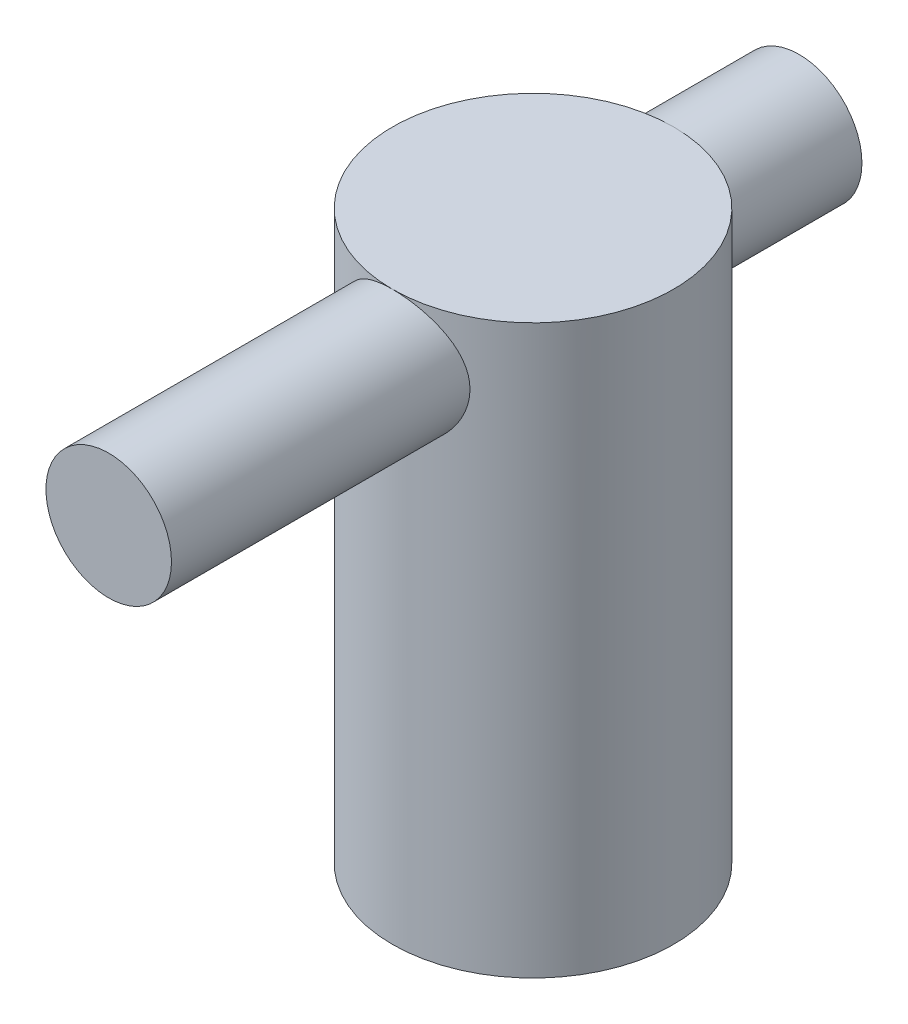
ISO-10303-21;
HEADER;
FILE_DESCRIPTION(('STEP AP214'),'2;1');
FILE_NAME('part.step','',(''),(''),'','','');
FILE_SCHEMA(('AUTOMOTIVE_DESIGN { 1 0 10303 214 1 1 1 1 }'));
ENDSEC;
DATA;
#1=APPLICATION_CONTEXT('core data for automotive mechanical design processes');
#2=APPLICATION_PROTOCOL_DEFINITION('international standard','automotive_design',2000,#1);
#3=PRODUCT_CONTEXT('',#1,'mechanical');
#4=PRODUCT('Part','Part','',(#3));
#5=PRODUCT_RELATED_PRODUCT_CATEGORY('part','',(#4));
#6=PRODUCT_DEFINITION_FORMATION('','',#4);
#7=PRODUCT_DEFINITION_CONTEXT('part definition',#1,'design');
#8=PRODUCT_DEFINITION('design','',#6,#7);
#9=PRODUCT_DEFINITION_SHAPE('','',#8);
#10=(LENGTH_UNIT() NAMED_UNIT(*) SI_UNIT(.MILLI.,.METRE.));
#11=(NAMED_UNIT(*) PLANE_ANGLE_UNIT() SI_UNIT($,.RADIAN.));
#12=(NAMED_UNIT(*) SI_UNIT($,.STERADIAN.) SOLID_ANGLE_UNIT());
#13=UNCERTAINTY_MEASURE_WITH_UNIT(LENGTH_MEASURE(1.E-05),#10,'distance_accuracy_value','');
#14=(GEOMETRIC_REPRESENTATION_CONTEXT(3) GLOBAL_UNCERTAINTY_ASSIGNED_CONTEXT((#13)) GLOBAL_UNIT_ASSIGNED_CONTEXT((#10,
#11,#12)) REPRESENTATION_CONTEXT('',''));
#15=CARTESIAN_POINT('',(0.,0.,0.));
#16=DIRECTION('',(0.,0.,1.));
#17=DIRECTION('',(1.,0.,0.));
#18=AXIS2_PLACEMENT_3D('',#15,#16,#17);
#19=CARTESIAN_POINT('',(0.,57.404,0.));
#20=DIRECTION('',(0.,-1.,0.));
#21=DIRECTION('',(0.,0.,-1.));
#22=AXIS2_PLACEMENT_3D('',#19,#20,#21);
#23=CYLINDRICAL_SURFACE('',#22,14.224);
#24=CARTESIAN_POINT('',(0.,57.404,0.));
#25=DIRECTION('',(0.,1.,0.));
#26=DIRECTION('',(0.,0.,1.));
#27=AXIS2_PLACEMENT_3D('',#24,#25,#26);
#28=CIRCLE('',#27,14.224);
#29=CARTESIAN_POINT('',(0.,57.404,-14.224));
#30=VERTEX_POINT('',#29);
#31=CARTESIAN_POINT('',(0.,57.404,14.224));
#32=VERTEX_POINT('',#31);
#33=EDGE_CURVE('E55',#30,#32,#28,.T.);
#34=ORIENTED_EDGE('',*,*,#33,.F.);
#35=CARTESIAN_POINT('',(0.,57.404,-14.224));
#36=CARTESIAN_POINT('',(-0.169064131729769,57.4039987415316,-14.2239989454364));
#37=CARTESIAN_POINT('',(-0.338170293414769,57.3972394062399,-14.2209778895958));
#38=CARTESIAN_POINT('',(-0.675164422776245,57.3702689876632,-14.2089685890767));
#39=CARTESIAN_POINT('',(-0.843051645611251,57.3500502817015,-14.1999769629898));
#40=CARTESIAN_POINT('',(-1.17659843144288,57.2963313387486,-14.1762405036873));
#41=CARTESIAN_POINT('',(-1.3422532667633,57.2628064522875,-14.1614849937835));
#42=CARTESIAN_POINT('',(-1.66989459320146,57.1828175198381,-14.1265985270013));
#43=CARTESIAN_POINT('',(-1.83187955533246,57.1363481842083,-14.1064653727319));
#44=CARTESIAN_POINT('',(-2.1503925253457,57.0311505420019,-14.0614279364772));
#45=CARTESIAN_POINT('',(-2.30693987451225,56.9724723345735,-14.0365431859962));
#46=CARTESIAN_POINT('',(-2.61436305128336,56.8432506515707,-13.9825481897339));
#47=CARTESIAN_POINT('',(-2.76523672788118,56.7727027303378,-13.9534363613131));
#48=CARTESIAN_POINT('',(-3.06032218322675,56.6203698611024,-13.8916990738707));
#49=CARTESIAN_POINT('',(-3.20453829419942,56.5385923621843,-13.8590759471269));
#50=CARTESIAN_POINT('',(-3.48569666746665,56.364348868719,-13.7910499149219));
#51=CARTESIAN_POINT('',(-3.62263625501127,56.2718789829275,-13.7556459989702));
#52=CARTESIAN_POINT('',(-4.03500412909824,55.9694022284064,-13.6427491781487));
#53=CARTESIAN_POINT('',(-4.29702558535442,55.7420183063951,-13.5618075704459));
#54=CARTESIAN_POINT('',(-4.78065056902209,55.2477492948067,-13.3989880389265));
#55=CARTESIAN_POINT('',(-5.00222978854211,54.9808406222078,-13.3171095832257));
#56=CARTESIAN_POINT('',(-5.30621568033235,54.5468901638267,-13.1976917762748));
#57=CARTESIAN_POINT('',(-5.40507304101554,54.3919006889985,-13.1574063970087));
#58=CARTESIAN_POINT('',(-5.58927624131654,54.0733222806299,-13.0802190265538));
#59=CARTESIAN_POINT('',(-5.67462772885047,53.9097369800369,-13.0433156238141));
#60=CARTESIAN_POINT('',(-5.83107812880833,53.5749471949456,-12.9741292300982));
#61=CARTESIAN_POINT('',(-5.90217701861777,53.4037426983585,-12.941846246453));
#62=CARTESIAN_POINT('',(-6.02935119148151,53.0549623701482,-12.8830901247516));
#63=CARTESIAN_POINT('',(-6.08543458216381,52.8773900358176,-12.8566138527603));
#64=CARTESIAN_POINT('',(-6.17941066513843,52.5266176151303,-12.8116989603364));
#65=CARTESIAN_POINT('',(-6.21810297278447,52.3536764732965,-12.7929116873767));
#66=CARTESIAN_POINT('',(-6.28093882906494,52.0046466254234,-12.7621789609949));
#67=CARTESIAN_POINT('',(-6.30508940813674,51.8285594828383,-12.7502302015199));
#68=CARTESIAN_POINT('',(-6.33853971923257,51.4746988545944,-12.7336342324333));
#69=CARTESIAN_POINT('',(-6.347844744329,51.296925992718,-12.7289844204456));
#70=CARTESIAN_POINT('',(-6.35148865273605,50.9411942243157,-12.7271668063681));
#71=CARTESIAN_POINT('',(-6.34582851131983,50.763235330669,-12.7299985167108));
#72=CARTESIAN_POINT('',(-6.32081807462496,50.4248065446407,-12.7424330938839));
#73=CARTESIAN_POINT('',(-6.3027574110348,50.2642157571043,-12.7513978428272));
#74=CARTESIAN_POINT('',(-6.25453306144935,49.9452437530645,-12.7751209170416));
#75=CARTESIAN_POINT('',(-6.22436546854594,49.7868632669143,-12.7898811124708));
#76=CARTESIAN_POINT('',(-6.15225191906018,49.4734460825589,-12.8247249950343));
#77=CARTESIAN_POINT('',(-6.11030831443204,49.3184087233017,-12.844807619106));
#78=CARTESIAN_POINT('',(-6.01502717545124,49.0125237281115,-12.8897011825212));
#79=CARTESIAN_POINT('',(-5.96168522056778,48.8616777434075,-12.9145139559167));
#80=CARTESIAN_POINT('',(-5.84276161844015,48.5617681937587,-12.968757486444));
#81=CARTESIAN_POINT('',(-5.77693555937323,48.4128176670755,-12.9982781705812));
#82=CARTESIAN_POINT('',(-5.63437970471472,48.1209663367698,-13.0607046943084));
#83=CARTESIAN_POINT('',(-5.5576462460126,47.9780675865703,-13.0936116701121));
#84=CARTESIAN_POINT('',(-5.31177387979408,47.5594151848417,-13.1961624273931));
#85=CARTESIAN_POINT('',(-5.12690085590811,47.2935497214102,-13.2696656267034));
#86=CARTESIAN_POINT('',(-4.81162285348535,46.9064403413664,-13.3859891191241));
#87=CARTESIAN_POINT('',(-4.69417522661855,46.7739808688531,-13.4277224376545));
#88=CARTESIAN_POINT('',(-4.44861453742545,46.5192930799527,-13.51106185828));
#89=CARTESIAN_POINT('',(-4.32050443238619,46.3970619454262,-13.5526679923533));
#90=CARTESIAN_POINT('',(-4.0542217604112,46.1634796896047,-13.6346942414802));
#91=CARTESIAN_POINT('',(-3.91604244673153,46.0521359824765,-13.6751135353872));
#92=CARTESIAN_POINT('',(-3.63048073575631,45.8411693149707,-13.7536795817658));
#93=CARTESIAN_POINT('',(-3.48310204162086,45.7415416843368,-13.791827236743));
#94=CARTESIAN_POINT('',(-3.17526288425157,45.5518290532424,-13.8659908790356));
#95=CARTESIAN_POINT('',(-3.0145401099018,45.4621293773051,-13.9019059080407));
#96=CARTESIAN_POINT('',(-2.68521731677173,45.2967400266662,-13.9692524691579));
#97=CARTESIAN_POINT('',(-2.51662057970846,45.221044579393,-14.0006858473847));
#98=CARTESIAN_POINT('',(-2.17271141392278,45.0844063116851,-14.0581606990394));
#99=CARTESIAN_POINT('',(-1.99740095412563,45.0234592038214,-14.084203739151));
#100=CARTESIAN_POINT('',(-1.64137231314383,44.916988490521,-14.1301194515932));
#101=CARTESIAN_POINT('',(-1.46065461419103,44.8714635141335,-14.1499926723768));
#102=CARTESIAN_POINT('',(-1.10819523205099,44.7990454890028,-14.1817894834687));
#103=CARTESIAN_POINT('',(-0.936717799404804,44.7710660135281,-14.1941743880478));
#104=CARTESIAN_POINT('',(-0.591718289173316,44.729242559258,-14.2127365162427));
#105=CARTESIAN_POINT('',(-0.418196346100836,44.7153976557132,-14.2189141459667));
#106=CARTESIAN_POINT('',(-0.0705420384489613,44.7020099706676,-14.2248872665466));
#107=CARTESIAN_POINT('',(0.103590138006332,44.7024631129845,-14.2246845763468));
#108=CARTESIAN_POINT('',(0.451102210308927,44.7176561972051,-14.2179070847327));
#109=CARTESIAN_POINT('',(0.624482127604827,44.732395729047,-14.2113324662118));
#110=CARTESIAN_POINT('',(0.958925872296469,44.7746946422579,-14.1925691248646));
#111=CARTESIAN_POINT('',(1.12011268888394,44.8014461214442,-14.1807346182033));
#112=CARTESIAN_POINT('',(1.43955285914873,44.8671763907251,-14.1518758560333));
#113=CARTESIAN_POINT('',(1.59780524879768,44.9061591262578,-14.1348499259763));
#114=CARTESIAN_POINT('',(1.91025786414708,44.9959614216401,-14.096023195584));
#115=CARTESIAN_POINT('',(2.06445925291635,45.046777541788,-14.0742237829035));
#116=CARTESIAN_POINT('',(2.36799407551973,45.1598209651761,-14.0263467006255));
#117=CARTESIAN_POINT('',(2.51732562549471,45.2220526241755,-14.0002673983777));
#118=CARTESIAN_POINT('',(2.81475768702214,45.3595033524635,-13.9435621901501));
#119=CARTESIAN_POINT('',(2.96267895853888,45.4350631018436,-13.9128210839485));
#120=CARTESIAN_POINT('',(3.25165385011778,45.5971945861696,-13.8481366043457));
#121=CARTESIAN_POINT('',(3.39270491851985,45.6837703700971,-13.8141920546987));
#122=CARTESIAN_POINT('',(3.80444154846649,45.9591333152942,-13.7087013216744));
#123=CARTESIAN_POINT('',(4.06387255196499,46.1636314296955,-13.633465876444));
#124=CARTESIAN_POINT('',(4.56717971985251,46.627950297176,-13.4736195924533));
#125=CARTESIAN_POINT('',(4.80807968829956,46.8909158985695,-13.388743660402));
#126=CARTESIAN_POINT('',(5.13436921385734,47.313341946557,-13.2655200786573));
#127=CARTESIAN_POINT('',(5.23735015928865,47.4589279071326,-13.2250997857719));
#128=CARTESIAN_POINT('',(5.43096216440055,47.7587083729981,-13.1467756913302));
#129=CARTESIAN_POINT('',(5.52159808495032,47.9128994560996,-13.1088709023231));
#130=CARTESIAN_POINT('',(5.6919259511535,48.2329785409307,-13.0358338851607));
#131=CARTESIAN_POINT('',(5.77129071415856,48.3990617997318,-13.0007937377191));
#132=CARTESIAN_POINT('',(5.91556212889423,48.7382772141741,-12.9357861183189));
#133=CARTESIAN_POINT('',(5.9804751848489,48.9114062071299,-12.905816400836));
#134=CARTESIAN_POINT('',(6.09513432155158,49.2634455547587,-12.8520631516823));
#135=CARTESIAN_POINT('',(6.14488936920736,49.4423524219022,-12.8282759638874));
#136=CARTESIAN_POINT('',(6.22864768874855,49.8046021960672,-12.787818287225));
#137=CARTESIAN_POINT('',(6.26265276275062,49.9879445930469,-12.771146984173));
#138=CARTESIAN_POINT('',(6.31222710443848,50.3416717529188,-12.7467116124661));
#139=CARTESIAN_POINT('',(6.32912158768412,50.5118276915818,-12.7383090273014));
#140=CARTESIAN_POINT('',(6.34912391978851,50.8531441440756,-12.7283514305887));
#141=CARTESIAN_POINT('',(6.35223267108621,51.0243045914151,-12.7267959708155));
#142=CARTESIAN_POINT('',(6.34462473222798,51.3662057270815,-12.7305903066576));
#143=CARTESIAN_POINT('',(6.33391064813108,51.5369464884533,-12.7359388006507));
#144=CARTESIAN_POINT('',(6.29879998872588,51.8766652323429,-12.7533398469021));
#145=CARTESIAN_POINT('',(6.27440363643877,52.0456432435478,-12.765392289886));
#146=CARTESIAN_POINT('',(6.21414570374576,52.3702225472795,-12.7948276807417));
#147=CARTESIAN_POINT('',(6.17908212900159,52.5260070726241,-12.811836924727));
#148=CARTESIAN_POINT('',(6.09751083985731,52.8339561930594,-12.8508591355222));
#149=CARTESIAN_POINT('',(6.05099947412219,52.9861196161645,-12.8728736986345));
#150=CARTESIAN_POINT('',(5.94695821933483,53.2858942152981,-12.9212674037334));
#151=CARTESIAN_POINT('',(5.88942977445863,53.4335059850398,-12.9476459736017));
#152=CARTESIAN_POINT('',(5.76380680383267,53.7234619560933,-13.0040549581279));
#153=CARTESIAN_POINT('',(5.69570841117874,53.8658042059089,-13.0340867083902));
#154=CARTESIAN_POINT('',(5.46689995021055,54.3016956449513,-13.1325516547723));
#155=CARTESIAN_POINT('',(5.28828946531234,54.5849199990436,-13.2061290912658));
#156=CARTESIAN_POINT('',(4.88973585599202,55.1189868354345,-13.3588197028986));
#157=CARTESIAN_POINT('',(4.66977527247781,55.3698155637068,-13.4379352074663));
#158=CARTESIAN_POINT('',(4.30178572595674,55.7283991352134,-13.558596272528));
#159=CARTESIAN_POINT('',(4.16658201765511,55.8493136157509,-13.6008527591879));
#160=CARTESIAN_POINT('',(3.88602995057586,56.0793503387565,-13.6836509839816));
#161=CARTESIAN_POINT('',(3.7406851569712,56.1884766913893,-13.7241933167689));
#162=CARTESIAN_POINT('',(3.44051666705064,56.394271057481,-13.8025036243447));
#163=CARTESIAN_POINT('',(3.28568426105107,56.4909273627828,-13.8402689777215));
#164=CARTESIAN_POINT('',(2.96765193535108,56.6708406114404,-13.9119289609799));
#165=CARTESIAN_POINT('',(2.80445593202991,56.7541037521006,-13.9458253789799));
#166=CARTESIAN_POINT('',(2.47241626069171,56.9057196297752,-14.0084824637683));
#167=CARTESIAN_POINT('',(2.30364811527158,56.9742171664823,-14.0372924515292));
#168=CARTESIAN_POINT('',(1.96015685953324,57.0966406505657,-14.0893616536695));
#169=CARTESIAN_POINT('',(1.78543666428462,57.1505736187355,-14.1126235418546));
#170=CARTESIAN_POINT('',(1.43174620718754,57.2431796972977,-14.1528755433288));
#171=CARTESIAN_POINT('',(1.2527871715224,57.2818891785686,-14.169880598655));
#172=CARTESIAN_POINT('',(0.891782266010684,57.3437312810012,-14.1971694062276));
#173=CARTESIAN_POINT('',(0.70973862152527,57.3668746794547,-14.2074578086529));
#174=CARTESIAN_POINT('',(0.439369739434102,57.3893919419729,-14.2174833835323));
#175=CARTESIAN_POINT('',(0.35160841261814,57.3948677475147,-14.2199250923983));
#176=CARTESIAN_POINT('',(0.175901850736047,57.4021721264098,-14.2231836849856));
#177=CARTESIAN_POINT('',(0.0879566134123702,57.4040006547256,-14.2240005486429));
#178=CARTESIAN_POINT('',(0.,57.404,-14.224));
#179=B_SPLINE_CURVE_WITH_KNOTS('',3,(#35,#36,#37,#38,#39,#40,#41,#42,#43,#44,#45,#46,#47,#48,
#49,#50,#51,#52,#53,#54,#55,#56,#57,#58,#59,#60,#61,#62,#63,#64,#65,#66,#67,#68,#69,#70,#71,#72,
#73,#74,#75,#76,#77,#78,#79,#80,#81,#82,#83,#84,#85,#86,#87,#88,#89,#90,#91,#92,#93,#94,#95,#96,
#97,#98,#99,#100,#101,#102,#103,#104,#105,#106,#107,#108,#109,#110,#111,#112,#113,#114,#115,
#116,#117,#118,#119,#120,#121,#122,#123,#124,#125,#126,#127,#128,#129,#130,#131,#132,#133,#134,
#135,#136,#137,#138,#139,#140,#141,#142,#143,#144,#145,#146,#147,#148,#149,#150,#151,#152,#153,
#154,#155,#156,#157,#158,#159,#160,#161,#162,#163,#164,#165,#166,#167,#168,#169,#170,#171,#172,
#173,#174,#175,#176,#177,#178),.UNSPECIFIED.,.T.,.F.,(4,2,2,2,2,2,2,2,2,2,2,2,2,2,2,2,2,2,2,2,2,
2,2,2,2,2,2,2,2,2,2,2,2,2,2,2,2,2,2,2,2,2,2,2,2,2,2,2,2,2,2,2,2,2,2,2,2,2,2,2,2,2,2,2,2,2,2,2,2,
2,2,4),(0.,0.507104156892433,1.01449575541371,1.52283170822346,2.03137569379082,
2.53787263049204,3.0445596935521,3.55091225746562,4.05744967999993,5.12132603718107,
6.18583974872282,6.74982329801768,7.31357037255168,7.87731834157231,8.44076129782051,
8.97466088263864,9.50830213725078,10.0417530834684,10.5751692657851,11.0601548869978,
11.5452971391577,12.0303425655267,12.5155764456948,13.0115323922066,13.507655294428,
14.4993956775397,15.0445766767953,15.5896069683079,16.1350058691069,16.6801866210055,
17.2420510441736,17.8036833471365,18.3651521836098,18.9265710951912,19.4484492051604,
19.9702931692531,20.4919883639323,21.0136685848518,21.5045616913013,21.9956133082879,
22.486522365277,22.9776191266252,23.4838257539312,23.9902189796158,25.00246679058,
26.0969547422251,26.6449844220719,27.1927976868399,27.7541976911302,28.3153484155453,
28.8761665368122,29.4369204732407,29.9498392024438,30.4627243545639,30.9755128250958,
31.4882929374106,31.9695150606022,32.450890871556,32.932203624404,33.4136928772956,
34.4376559457124,35.4620523331176,36.0202141683233,36.5781807568456,37.1366674669594,
37.6948950052437,38.2473704340328,38.7995790668764,39.3504602685509,39.9009596698776,
40.1647803459189,40.4286042796608),.UNSPECIFIED.);
#180=EDGE_CURVE('E60',#30,#30,#179,.T.);
#181=ORIENTED_EDGE('',*,*,#180,.T.);
#182=EDGE_CURVE('E11',#32,#30,#28,.T.);
#183=ORIENTED_EDGE('',*,*,#182,.F.);
#184=CARTESIAN_POINT('',(0.,57.404,14.224));
#185=CARTESIAN_POINT('',(0.169064131729771,57.4039987415316,14.2239989454364));
#186=CARTESIAN_POINT('',(0.33817029341477,57.3972394062399,14.2209778895958));
#187=CARTESIAN_POINT('',(0.675164422776247,57.3702689876632,14.2089685890767));
#188=CARTESIAN_POINT('',(0.843051645611252,57.3500502817015,14.1999769629898));
#189=CARTESIAN_POINT('',(1.17659843144288,57.2963313387486,14.1762405036873));
#190=CARTESIAN_POINT('',(1.3422532667633,57.2628064522876,14.1614849937835));
#191=CARTESIAN_POINT('',(1.66989459320146,57.1828175198381,14.1265985270013));
#192=CARTESIAN_POINT('',(1.83187955533246,57.1363481842083,14.1064653727319));
#193=CARTESIAN_POINT('',(2.1503925253457,57.0311505420019,14.0614279364772));
#194=CARTESIAN_POINT('',(2.30693987451226,56.9724723345735,14.0365431859962));
#195=CARTESIAN_POINT('',(2.61436305128336,56.8432506515707,13.9825481897339));
#196=CARTESIAN_POINT('',(2.76523672788118,56.7727027303378,13.9534363613131));
#197=CARTESIAN_POINT('',(3.06032218322676,56.6203698611024,13.8916990738707));
#198=CARTESIAN_POINT('',(3.20453829419943,56.5385923621843,13.8590759471269));
#199=CARTESIAN_POINT('',(3.48569666746665,56.364348868719,13.7910499149219));
#200=CARTESIAN_POINT('',(3.62263625501127,56.2718789829275,13.7556459989702));
#201=CARTESIAN_POINT('',(4.03500412909824,55.9694022284064,13.6427491781487));
#202=CARTESIAN_POINT('',(4.29702558535442,55.7420183063951,13.5618075704458));
#203=CARTESIAN_POINT('',(4.78065056902209,55.2477492948067,13.3989880389265));
#204=CARTESIAN_POINT('',(5.00222978854212,54.9808406222078,13.3171095832257));
#205=CARTESIAN_POINT('',(5.30621568033236,54.5468901638267,13.1976917762748));
#206=CARTESIAN_POINT('',(5.40507304101554,54.3919006889985,13.1574063970087));
#207=CARTESIAN_POINT('',(5.58927624131655,54.0733222806299,13.0802190265538));
#208=CARTESIAN_POINT('',(5.67462772885047,53.9097369800369,13.0433156238141));
#209=CARTESIAN_POINT('',(5.83107812880833,53.5749471949456,12.9741292300982));
#210=CARTESIAN_POINT('',(5.90217701861777,53.4037426983585,12.941846246453));
#211=CARTESIAN_POINT('',(6.02935119148151,53.0549623701482,12.8830901247516));
#212=CARTESIAN_POINT('',(6.08543458216381,52.8773900358176,12.8566138527603));
#213=CARTESIAN_POINT('',(6.17941066513844,52.5266176151303,12.8116989603364));
#214=CARTESIAN_POINT('',(6.21810297278447,52.3536764732965,12.7929116873767));
#215=CARTESIAN_POINT('',(6.28093882906494,52.0046466254234,12.7621789609949));
#216=CARTESIAN_POINT('',(6.30508940813675,51.8285594828383,12.7502302015199));
#217=CARTESIAN_POINT('',(6.33853971923257,51.4746988545945,12.7336342324333));
#218=CARTESIAN_POINT('',(6.347844744329,51.296925992718,12.7289844204456));
#219=CARTESIAN_POINT('',(6.35148865273606,50.9411942243157,12.7271668063681));
#220=CARTESIAN_POINT('',(6.34582851131984,50.763235330669,12.7299985167108));
#221=CARTESIAN_POINT('',(6.32081807462496,50.4248065446407,12.7424330938839));
#222=CARTESIAN_POINT('',(6.30275741103481,50.2642157571043,12.7513978428272));
#223=CARTESIAN_POINT('',(6.25453306144935,49.9452437530645,12.7751209170416));
#224=CARTESIAN_POINT('',(6.22436546854594,49.7868632669143,12.7898811124708));
#225=CARTESIAN_POINT('',(6.15225191906018,49.4734460825589,12.8247249950343));
#226=CARTESIAN_POINT('',(6.11030831443204,49.3184087233017,12.844807619106));
#227=CARTESIAN_POINT('',(6.01502717545124,49.0125237281115,12.8897011825212));
#228=CARTESIAN_POINT('',(5.96168522056779,48.8616777434075,12.9145139559167));
#229=CARTESIAN_POINT('',(5.84276161844015,48.5617681937587,12.968757486444));
#230=CARTESIAN_POINT('',(5.77693555937323,48.4128176670755,12.9982781705812));
#231=CARTESIAN_POINT('',(5.63437970471472,48.1209663367698,13.0607046943084));
#232=CARTESIAN_POINT('',(5.5576462460126,47.9780675865703,13.0936116701121));
#233=CARTESIAN_POINT('',(5.31177387979408,47.5594151848417,13.1961624273931));
#234=CARTESIAN_POINT('',(5.12690085590811,47.2935497214102,13.2696656267034));
#235=CARTESIAN_POINT('',(4.81162285348535,46.9064403413664,13.3859891191241));
#236=CARTESIAN_POINT('',(4.69417522661855,46.7739808688531,13.4277224376545));
#237=CARTESIAN_POINT('',(4.44861453742545,46.5192930799527,13.51106185828));
#238=CARTESIAN_POINT('',(4.32050443238619,46.3970619454262,13.5526679923533));
#239=CARTESIAN_POINT('',(4.0542217604112,46.1634796896047,13.6346942414802));
#240=CARTESIAN_POINT('',(3.91604244673153,46.0521359824765,13.6751135353872));
#241=CARTESIAN_POINT('',(3.63048073575631,45.8411693149707,13.7536795817658));
#242=CARTESIAN_POINT('',(3.48310204162086,45.7415416843368,13.791827236743));
#243=CARTESIAN_POINT('',(3.17526288425157,45.5518290532424,13.8659908790356));
#244=CARTESIAN_POINT('',(3.0145401099018,45.4621293773051,13.9019059080407));
#245=CARTESIAN_POINT('',(2.68521731677173,45.2967400266662,13.9692524691579));
#246=CARTESIAN_POINT('',(2.51662057970846,45.221044579393,14.0006858473847));
#247=CARTESIAN_POINT('',(2.17271141392278,45.0844063116851,14.0581606990394));
#248=CARTESIAN_POINT('',(1.99740095412563,45.0234592038214,14.084203739151));
#249=CARTESIAN_POINT('',(1.64137231314383,44.916988490521,14.1301194515932));
#250=CARTESIAN_POINT('',(1.46065461419103,44.8714635141335,14.1499926723768));
#251=CARTESIAN_POINT('',(1.108195232051,44.7990454890028,14.1817894834687));
#252=CARTESIAN_POINT('',(0.936717799404807,44.7710660135281,14.1941743880478));
#253=CARTESIAN_POINT('',(0.591718289173321,44.729242559258,14.2127365162427));
#254=CARTESIAN_POINT('',(0.418196346100842,44.7153976557132,14.2189141459667));
#255=CARTESIAN_POINT('',(0.0705420384489678,44.7020099706676,14.2248872665466));
#256=CARTESIAN_POINT('',(-0.103590138006326,44.7024631129845,14.2246845763468));
#257=CARTESIAN_POINT('',(-0.451102210308921,44.7176561972051,14.2179070847327));
#258=CARTESIAN_POINT('',(-0.624482127604822,44.732395729047,14.2113324662118));
#259=CARTESIAN_POINT('',(-0.958925872296463,44.7746946422579,14.1925691248646));
#260=CARTESIAN_POINT('',(-1.12011268888393,44.8014461214442,14.1807346182033));
#261=CARTESIAN_POINT('',(-1.43955285914872,44.8671763907251,14.1518758560333));
#262=CARTESIAN_POINT('',(-1.59780524879768,44.9061591262578,14.1348499259763));
#263=CARTESIAN_POINT('',(-1.91025786414708,44.9959614216401,14.096023195584));
#264=CARTESIAN_POINT('',(-2.06445925291635,45.046777541788,14.0742237829035));
#265=CARTESIAN_POINT('',(-2.36799407551973,45.1598209651761,14.0263467006255));
#266=CARTESIAN_POINT('',(-2.5173256254947,45.2220526241755,14.0002673983777));
#267=CARTESIAN_POINT('',(-2.81475768702214,45.3595033524635,13.9435621901501));
#268=CARTESIAN_POINT('',(-2.96267895853887,45.4350631018436,13.9128210839485));
#269=CARTESIAN_POINT('',(-3.25165385011778,45.5971945861696,13.8481366043457));
#270=CARTESIAN_POINT('',(-3.39270491851984,45.6837703700971,13.8141920546987));
#271=CARTESIAN_POINT('',(-3.80444154846648,45.9591333152942,13.7087013216744));
#272=CARTESIAN_POINT('',(-4.06387255196499,46.1636314296955,13.633465876444));
#273=CARTESIAN_POINT('',(-4.56717971985251,46.627950297176,13.4736195924533));
#274=CARTESIAN_POINT('',(-4.80807968829956,46.8909158985695,13.388743660402));
#275=CARTESIAN_POINT('',(-5.13436921385733,47.313341946557,13.2655200786573));
#276=CARTESIAN_POINT('',(-5.23735015928864,47.4589279071326,13.2250997857719));
#277=CARTESIAN_POINT('',(-5.43096216440054,47.7587083729981,13.1467756913302));
#278=CARTESIAN_POINT('',(-5.52159808495032,47.9128994560996,13.1088709023231));
#279=CARTESIAN_POINT('',(-5.69192595115349,48.2329785409307,13.0358338851607));
#280=CARTESIAN_POINT('',(-5.77129071415855,48.3990617997318,13.0007937377191));
#281=CARTESIAN_POINT('',(-5.91556212889422,48.7382772141741,12.9357861183189));
#282=CARTESIAN_POINT('',(-5.98047518484889,48.9114062071299,12.905816400836));
#283=CARTESIAN_POINT('',(-6.09513432155158,49.2634455547587,12.8520631516823));
#284=CARTESIAN_POINT('',(-6.14488936920736,49.4423524219022,12.8282759638874));
#285=CARTESIAN_POINT('',(-6.22864768874854,49.8046021960672,12.787818287225));
#286=CARTESIAN_POINT('',(-6.26265276275062,49.9879445930468,12.771146984173));
#287=CARTESIAN_POINT('',(-6.31222710443848,50.3416717529188,12.7467116124661));
#288=CARTESIAN_POINT('',(-6.32912158768411,50.5118276915818,12.7383090273014));
#289=CARTESIAN_POINT('',(-6.34912391978851,50.8531441440756,12.7283514305887));
#290=CARTESIAN_POINT('',(-6.35223267108621,51.0243045914151,12.7267959708155));
#291=CARTESIAN_POINT('',(-6.34462473222798,51.3662057270815,12.7305903066576));
#292=CARTESIAN_POINT('',(-6.33391064813108,51.5369464884533,12.7359388006507));
#293=CARTESIAN_POINT('',(-6.29879998872588,51.8766652323429,12.7533398469021));
#294=CARTESIAN_POINT('',(-6.27440363643877,52.0456432435478,12.7653922898861));
#295=CARTESIAN_POINT('',(-6.21414570374575,52.3702225472795,12.7948276807417));
#296=CARTESIAN_POINT('',(-6.17908212900159,52.5260070726241,12.811836924727));
#297=CARTESIAN_POINT('',(-6.0975108398573,52.8339561930594,12.8508591355222));
#298=CARTESIAN_POINT('',(-6.05099947412218,52.9861196161645,12.8728736986345));
#299=CARTESIAN_POINT('',(-5.94695821933483,53.2858942152981,12.9212674037334));
#300=CARTESIAN_POINT('',(-5.88942977445863,53.4335059850398,12.9476459736017));
#301=CARTESIAN_POINT('',(-5.76380680383266,53.7234619560933,13.0040549581279));
#302=CARTESIAN_POINT('',(-5.69570841117874,53.8658042059089,13.0340867083902));
#303=CARTESIAN_POINT('',(-5.46689995021055,54.3016956449513,13.1325516547723));
#304=CARTESIAN_POINT('',(-5.28828946531234,54.5849199990436,13.2061290912658));
#305=CARTESIAN_POINT('',(-4.88973585599202,55.1189868354345,13.3588197028986));
#306=CARTESIAN_POINT('',(-4.66977527247781,55.3698155637068,13.4379352074663));
#307=CARTESIAN_POINT('',(-4.30178572595674,55.7283991352134,13.558596272528));
#308=CARTESIAN_POINT('',(-4.16658201765511,55.8493136157509,13.6008527591879));
#309=CARTESIAN_POINT('',(-3.88602995057585,56.0793503387565,13.6836509839816));
#310=CARTESIAN_POINT('',(-3.74068515697119,56.1884766913893,13.7241933167689));
#311=CARTESIAN_POINT('',(-3.44051666705064,56.394271057481,13.8025036243447));
#312=CARTESIAN_POINT('',(-3.28568426105107,56.4909273627828,13.8402689777215));
#313=CARTESIAN_POINT('',(-2.96765193535108,56.6708406114404,13.9119289609799));
#314=CARTESIAN_POINT('',(-2.80445593202991,56.7541037521006,13.9458253789799));
#315=CARTESIAN_POINT('',(-2.47241626069171,56.9057196297752,14.0084824637683));
#316=CARTESIAN_POINT('',(-2.30364811527157,56.9742171664823,14.0372924515292));
#317=CARTESIAN_POINT('',(-1.96015685953324,57.0966406505657,14.0893616536695));
#318=CARTESIAN_POINT('',(-1.78543666428462,57.1505736187355,14.1126235418546));
#319=CARTESIAN_POINT('',(-1.43174620718753,57.2431796972977,14.1528755433288));
#320=CARTESIAN_POINT('',(-1.2527871715224,57.2818891785686,14.169880598655));
#321=CARTESIAN_POINT('',(-0.89178226601068,57.3437312810012,14.1971694062276));
#322=CARTESIAN_POINT('',(-0.709738621525267,57.3668746794547,14.2074578086529));
#323=CARTESIAN_POINT('',(-0.4393697394341,57.3893919419729,14.2174833835323));
#324=CARTESIAN_POINT('',(-0.351608412618138,57.3948677475147,14.2199250923983));
#325=CARTESIAN_POINT('',(-0.175901850736046,57.4021721264098,14.2231836849856));
#326=CARTESIAN_POINT('',(-0.0879566134123686,57.4040006547256,14.2240005486429));
#327=CARTESIAN_POINT('',(0.,57.404,14.224));
#328=B_SPLINE_CURVE_WITH_KNOTS('',3,(#184,#185,#186,#187,#188,#189,#190,#191,#192,#193,#194,
#195,#196,#197,#198,#199,#200,#201,#202,#203,#204,#205,#206,#207,#208,#209,#210,#211,#212,#213,
#214,#215,#216,#217,#218,#219,#220,#221,#222,#223,#224,#225,#226,#227,#228,#229,#230,#231,#232,
#233,#234,#235,#236,#237,#238,#239,#240,#241,#242,#243,#244,#245,#246,#247,#248,#249,#250,#251,
#252,#253,#254,#255,#256,#257,#258,#259,#260,#261,#262,#263,#264,#265,#266,#267,#268,#269,#270,
#271,#272,#273,#274,#275,#276,#277,#278,#279,#280,#281,#282,#283,#284,#285,#286,#287,#288,#289,
#290,#291,#292,#293,#294,#295,#296,#297,#298,#299,#300,#301,#302,#303,#304,#305,#306,#307,#308,
#309,#310,#311,#312,#313,#314,#315,#316,#317,#318,#319,#320,#321,#322,#323,#324,#325,#326,#327),
.UNSPECIFIED.,.T.,.F.,(4,2,2,2,2,2,2,2,2,2,2,2,2,2,2,2,2,2,2,2,2,2,2,2,2,2,2,2,2,2,2,2,2,2,2,2,
2,2,2,2,2,2,2,2,2,2,2,2,2,2,2,2,2,2,2,2,2,2,2,2,2,2,2,2,2,2,2,2,2,2,2,4),(0.,0.507104156892433,
1.01449575541371,1.52283170822346,2.03137569379082,2.53787263049204,3.04455969355211,
3.55091225746563,4.05744967999993,5.12132603718106,6.18583974872283,6.74982329801768,
7.31357037255168,7.87731834157231,8.44076129782052,8.97466088263864,9.50830213725077,
10.0417530834684,10.5751692657851,11.0601548869978,11.5452971391577,12.0303425655267,
12.5155764456948,13.0115323922067,13.507655294428,14.4993956775397,15.0445766767953,
15.5896069683079,16.135005869107,16.6801866210055,17.2420510441736,17.8036833471365,
18.3651521836098,18.9265710951912,19.4484492051604,19.9702931692531,20.4919883639323,
21.0136685848518,21.5045616913013,21.9956133082879,22.486522365277,22.9776191266252,
23.4838257539312,23.9902189796158,25.00246679058,26.0969547422251,26.6449844220719,
27.1927976868399,27.7541976911302,28.3153484155453,28.8761665368122,29.4369204732407,
29.9498392024438,30.4627243545639,30.9755128250958,31.4882929374106,31.9695150606022,
32.450890871556,32.932203624404,33.4136928772956,34.4376559457124,35.4620523331176,
36.0202141683233,36.5781807568456,37.1366674669594,37.6948950052437,38.2473704340328,
38.7995790668764,39.3504602685509,39.9009596698776,40.1647803459189,40.4286042796608),.UNSPECIFIED.);
#329=EDGE_CURVE('E64',#32,#32,#328,.T.);
#330=ORIENTED_EDGE('',*,*,#329,.T.);
#331=EDGE_LOOP('',(#34,#181,#183,#330));
#332=FACE_BOUND('',#331,.T.);
#333=CARTESIAN_POINT('',(0.,0.,0.));
#334=DIRECTION('',(0.,1.,0.));
#335=DIRECTION('',(0.,0.,1.));
#336=AXIS2_PLACEMENT_3D('',#333,#334,#335);
#337=CIRCLE('',#336,14.224);
#338=CARTESIAN_POINT('',(0.,0.,14.224));
#339=VERTEX_POINT('',#338);
#340=EDGE_CURVE('E49',#339,#339,#337,.T.);
#341=ORIENTED_EDGE('',*,*,#340,.T.);
#342=EDGE_LOOP('',(#341));
#343=FACE_BOUND('',#342,.T.);
#344=ADVANCED_FACE('F45',(#332,#343),#23,.T.);
#345=CARTESIAN_POINT('',(0.,57.404,0.));
#346=DIRECTION('',(0.,1.,0.));
#347=DIRECTION('',(0.,0.,1.));
#348=AXIS2_PLACEMENT_3D('',#345,#346,#347);
#349=PLANE('',#348);
#350=ORIENTED_EDGE('',*,*,#33,.T.);
#351=ORIENTED_EDGE('',*,*,#182,.T.);
#352=EDGE_LOOP('',(#350,#351));
#353=FACE_BOUND('',#352,.T.);
#354=ADVANCED_FACE('F95',(#353),#349,.T.);
#355=CARTESIAN_POINT('',(0.,0.,0.));
#356=DIRECTION('',(0.,1.,0.));
#357=DIRECTION('',(0.,0.,1.));
#358=AXIS2_PLACEMENT_3D('',#355,#356,#357);
#359=PLANE('',#358);
#360=ORIENTED_EDGE('',*,*,#340,.F.);
#361=EDGE_LOOP('',(#360));
#362=FACE_BOUND('',#361,.T.);
#363=ADVANCED_FACE('F98',(#362),#359,.F.);
#364=CARTESIAN_POINT('',(0.,51.054,42.926));
#365=DIRECTION('',(0.,0.,1.));
#366=DIRECTION('',(1.,0.,0.));
#367=AXIS2_PLACEMENT_3D('',#364,#365,#366);
#368=PLANE('',#367);
#369=CARTESIAN_POINT('',(0.,51.054,42.926));
#370=DIRECTION('',(0.,0.,1.));
#371=DIRECTION('',(1.,0.,0.));
#372=AXIS2_PLACEMENT_3D('',#369,#370,#371);
#373=CIRCLE('',#372,6.35);
#374=CARTESIAN_POINT('',(6.35,51.054,42.926));
#375=VERTEX_POINT('',#374);
#376=EDGE_CURVE('E77',#375,#375,#373,.T.);
#377=ORIENTED_EDGE('',*,*,#376,.T.);
#378=EDGE_LOOP('',(#377));
#379=FACE_BOUND('',#378,.T.);
#380=ADVANCED_FACE('F101',(#379),#368,.T.);
#381=CARTESIAN_POINT('',(0.,51.054,-26.924));
#382=DIRECTION('',(0.,0.,1.));
#383=DIRECTION('',(1.,0.,0.));
#384=AXIS2_PLACEMENT_3D('',#381,#382,#383);
#385=CYLINDRICAL_SURFACE('',#384,6.35);
#386=ORIENTED_EDGE('',*,*,#376,.F.);
#387=EDGE_LOOP('',(#386));
#388=FACE_BOUND('',#387,.T.);
#389=ORIENTED_EDGE('',*,*,#329,.F.);
#390=EDGE_LOOP('',(#389));
#391=FACE_BOUND('',#390,.T.);
#392=ADVANCED_FACE('F65',(#388,#391),#385,.T.);
#393=CARTESIAN_POINT('',(0.,51.054,-26.924));
#394=DIRECTION('',(0.,0.,1.));
#395=DIRECTION('',(1.,0.,0.));
#396=AXIS2_PLACEMENT_3D('',#393,#394,#395);
#397=CIRCLE('',#396,6.35);
#398=CARTESIAN_POINT('',(6.35,51.054,-26.924));
#399=VERTEX_POINT('',#398);
#400=EDGE_CURVE('E71',#399,#399,#397,.T.);
#401=ORIENTED_EDGE('',*,*,#400,.T.);
#402=EDGE_LOOP('',(#401));
#403=FACE_BOUND('',#402,.T.);
#404=ORIENTED_EDGE('',*,*,#180,.F.);
#405=EDGE_LOOP('',(#404));
#406=FACE_BOUND('',#405,.T.);
#407=ADVANCED_FACE('F87',(#403,#406),#385,.T.);
#408=CARTESIAN_POINT('',(0.,51.054,-26.924));
#409=DIRECTION('',(0.,0.,1.));
#410=DIRECTION('',(1.,0.,0.));
#411=AXIS2_PLACEMENT_3D('',#408,#409,#410);
#412=PLANE('',#411);
#413=ORIENTED_EDGE('',*,*,#400,.F.);
#414=EDGE_LOOP('',(#413));
#415=FACE_BOUND('',#414,.T.);
#416=ADVANCED_FACE('F92',(#415),#412,.F.);
#417=CLOSED_SHELL('',(#344,#354,#363,#380,#392,#407,#416));
#418=MANIFOLD_SOLID_BREP('B2',#417);
#419=ADVANCED_BREP_SHAPE_REPRESENTATION('',(#18,#418),#14);
#420=SHAPE_DEFINITION_REPRESENTATION(#9,#419);
ENDSEC;
END-ISO-10303-21;
